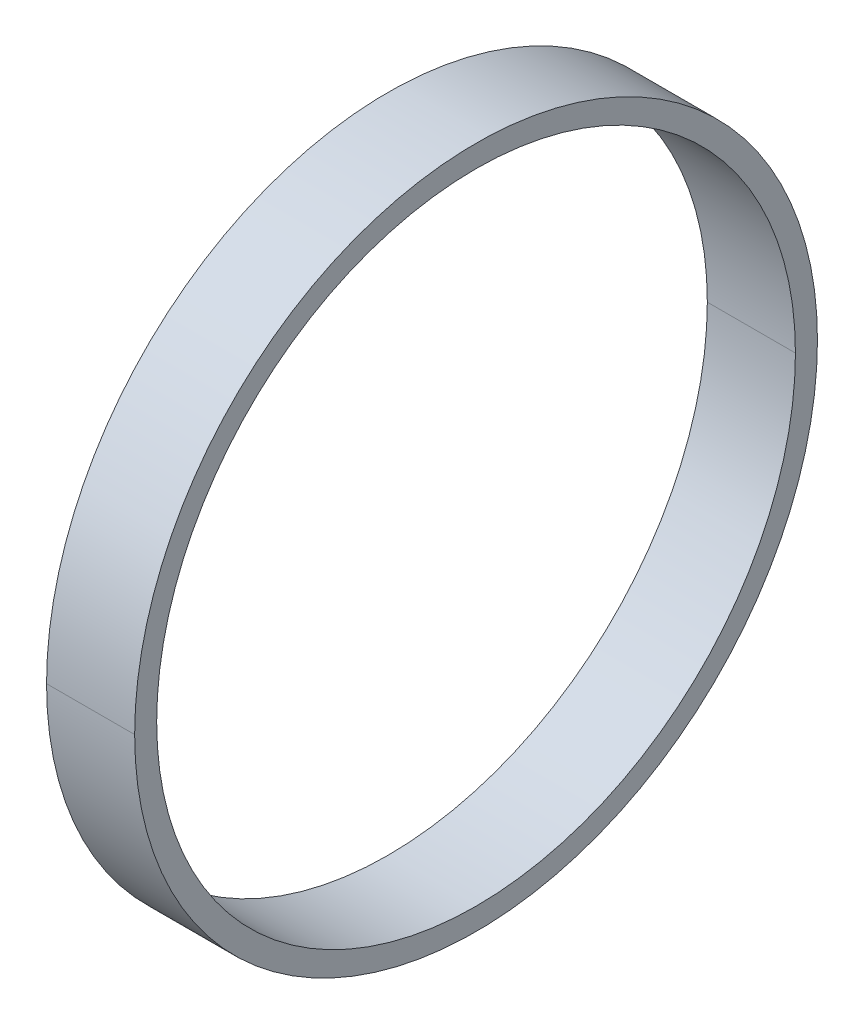
ISO-10303-21;
HEADER;
FILE_DESCRIPTION(('STEP AP214'),'2;1');
FILE_NAME('part.step','',(''),(''),'','','');
FILE_SCHEMA(('AUTOMOTIVE_DESIGN { 1 0 10303 214 1 1 1 1 }'));
ENDSEC;
DATA;
#1=APPLICATION_CONTEXT('core data for automotive mechanical design processes');
#2=APPLICATION_PROTOCOL_DEFINITION('international standard','automotive_design',2000,#1);
#3=PRODUCT_CONTEXT('',#1,'mechanical');
#4=PRODUCT('Part','Part','',(#3));
#5=PRODUCT_RELATED_PRODUCT_CATEGORY('part','',(#4));
#6=PRODUCT_DEFINITION_FORMATION('','',#4);
#7=PRODUCT_DEFINITION_CONTEXT('part definition',#1,'design');
#8=PRODUCT_DEFINITION('design','',#6,#7);
#9=PRODUCT_DEFINITION_SHAPE('','',#8);
#10=(LENGTH_UNIT() NAMED_UNIT(*) SI_UNIT(.MILLI.,.METRE.));
#11=(NAMED_UNIT(*) PLANE_ANGLE_UNIT() SI_UNIT($,.RADIAN.));
#12=(NAMED_UNIT(*) SI_UNIT($,.STERADIAN.) SOLID_ANGLE_UNIT());
#13=UNCERTAINTY_MEASURE_WITH_UNIT(LENGTH_MEASURE(1.E-05),#10,'distance_accuracy_value','');
#14=(GEOMETRIC_REPRESENTATION_CONTEXT(3) GLOBAL_UNCERTAINTY_ASSIGNED_CONTEXT((#13)) GLOBAL_UNIT_ASSIGNED_CONTEXT((#10,
#11,#12)) REPRESENTATION_CONTEXT('',''));
#15=CARTESIAN_POINT('',(0.,0.,0.));
#16=DIRECTION('',(0.,0.,1.));
#17=DIRECTION('',(1.,0.,0.));
#18=AXIS2_PLACEMENT_3D('',#15,#16,#17);
#19=CARTESIAN_POINT('',(0.,0.,0.));
#20=DIRECTION('',(-1.,0.,0.));
#21=DIRECTION('',(0.,0.,1.));
#22=AXIS2_PLACEMENT_3D('',#19,#20,#21);
#23=CYLINDRICAL_SURFACE('',#22,29.);
#24=DIRECTION('',(-1.,0.,0.));
#25=VECTOR('',#24,1.);
#26=CARTESIAN_POINT('',(0.,0.,-29.));
#27=LINE('',#26,#25);
#28=CARTESIAN_POINT('',(4.,0.,-29.));
#29=VERTEX_POINT('',#28);
#30=CARTESIAN_POINT('',(-4.,0.,-29.));
#31=VERTEX_POINT('',#30);
#32=EDGE_CURVE('E20',#29,#31,#27,.T.);
#33=ORIENTED_EDGE('',*,*,#32,.F.);
#34=CARTESIAN_POINT('',(4.,0.,0.));
#35=DIRECTION('',(-1.,0.,0.));
#36=DIRECTION('',(0.,0.,1.));
#37=AXIS2_PLACEMENT_3D('',#34,#35,#36);
#38=CIRCLE('',#37,29.);
#39=CARTESIAN_POINT('',(4.,0.,29.));
#40=VERTEX_POINT('',#39);
#41=EDGE_CURVE('E11',#40,#29,#38,.T.);
#42=ORIENTED_EDGE('',*,*,#41,.F.);
#43=DIRECTION('',(-1.,0.,0.));
#44=VECTOR('',#43,1.);
#45=CARTESIAN_POINT('',(0.,0.,29.));
#46=LINE('',#45,#44);
#47=CARTESIAN_POINT('',(-4.,0.,29.));
#48=VERTEX_POINT('',#47);
#49=EDGE_CURVE('E75',#40,#48,#46,.T.);
#50=ORIENTED_EDGE('',*,*,#49,.T.);
#51=CARTESIAN_POINT('',(-4.,0.,0.));
#52=DIRECTION('',(-1.,0.,0.));
#53=DIRECTION('',(0.,0.,1.));
#54=AXIS2_PLACEMENT_3D('',#51,#52,#53);
#55=CIRCLE('',#54,29.);
#56=EDGE_CURVE('E65',#48,#31,#55,.T.);
#57=ORIENTED_EDGE('',*,*,#56,.T.);
#58=EDGE_LOOP('',(#33,#42,#50,#57));
#59=FACE_BOUND('',#58,.T.);
#60=ADVANCED_FACE('F16',(#59),#23,.F.);
#61=CARTESIAN_POINT('',(4.,29.,0.));
#62=DIRECTION('',(-1.,0.,0.));
#63=DIRECTION('',(0.,0.,1.));
#64=AXIS2_PLACEMENT_3D('',#61,#62,#63);
#65=PLANE('',#64);
#66=ORIENTED_EDGE('',*,*,#41,.T.);
#67=CARTESIAN_POINT('',(4.,0.,0.));
#68=DIRECTION('',(-1.,0.,0.));
#69=DIRECTION('',(0.,0.,1.));
#70=AXIS2_PLACEMENT_3D('',#67,#68,#69);
#71=CIRCLE('',#70,29.);
#72=EDGE_CURVE('E85',#29,#40,#71,.T.);
#73=ORIENTED_EDGE('',*,*,#72,.T.);
#74=EDGE_LOOP('',(#66,#73));
#75=FACE_BOUND('',#74,.T.);
#76=CARTESIAN_POINT('',(4.,0.,0.));
#77=DIRECTION('',(-1.,0.,0.));
#78=DIRECTION('',(0.,0.,1.));
#79=AXIS2_PLACEMENT_3D('',#76,#77,#78);
#80=CIRCLE('',#79,31.);
#81=CARTESIAN_POINT('',(4.,0.,31.));
#82=VERTEX_POINT('',#81);
#83=CARTESIAN_POINT('',(4.,0.,-31.));
#84=VERTEX_POINT('',#83);
#85=EDGE_CURVE('E109',#82,#84,#80,.T.);
#86=ORIENTED_EDGE('',*,*,#85,.F.);
#87=CARTESIAN_POINT('',(4.,0.,0.));
#88=DIRECTION('',(-1.,0.,0.));
#89=DIRECTION('',(0.,0.,1.));
#90=AXIS2_PLACEMENT_3D('',#87,#88,#89);
#91=CIRCLE('',#90,31.);
#92=EDGE_CURVE('E27',#84,#82,#91,.T.);
#93=ORIENTED_EDGE('',*,*,#92,.F.);
#94=EDGE_LOOP('',(#86,#93));
#95=FACE_BOUND('',#94,.T.);
#96=ADVANCED_FACE('F163',(#75,#95),#65,.F.);
#97=CARTESIAN_POINT('',(0.,0.,0.));
#98=DIRECTION('',(-1.,0.,0.));
#99=DIRECTION('',(0.,0.,1.));
#100=AXIS2_PLACEMENT_3D('',#97,#98,#99);
#101=CYLINDRICAL_SURFACE('',#100,31.);
#102=DIRECTION('',(-1.,0.,0.));
#103=VECTOR('',#102,1.);
#104=CARTESIAN_POINT('',(0.,0.,-31.));
#105=LINE('',#104,#103);
#106=CARTESIAN_POINT('',(-4.,0.,-31.));
#107=VERTEX_POINT('',#106);
#108=EDGE_CURVE('E98',#84,#107,#105,.T.);
#109=ORIENTED_EDGE('',*,*,#108,.F.);
#110=ORIENTED_EDGE('',*,*,#92,.T.);
#111=DIRECTION('',(-1.,0.,0.));
#112=VECTOR('',#111,1.);
#113=CARTESIAN_POINT('',(0.,0.,31.));
#114=LINE('',#113,#112);
#115=CARTESIAN_POINT('',(-4.,0.,31.));
#116=VERTEX_POINT('',#115);
#117=EDGE_CURVE('E103',#82,#116,#114,.T.);
#118=ORIENTED_EDGE('',*,*,#117,.T.);
#119=CARTESIAN_POINT('',(-4.,0.,0.));
#120=DIRECTION('',(-1.,0.,0.));
#121=DIRECTION('',(0.,0.,1.));
#122=AXIS2_PLACEMENT_3D('',#119,#120,#121);
#123=CIRCLE('',#122,31.);
#124=EDGE_CURVE('E41',#107,#116,#123,.T.);
#125=ORIENTED_EDGE('',*,*,#124,.F.);
#126=EDGE_LOOP('',(#109,#110,#118,#125));
#127=FACE_BOUND('',#126,.T.);
#128=ADVANCED_FACE('F157',(#127),#101,.T.);
#129=CARTESIAN_POINT('',(-4.,29.,0.));
#130=DIRECTION('',(1.,0.,0.));
#131=DIRECTION('',(0.,1.,0.));
#132=AXIS2_PLACEMENT_3D('',#129,#130,#131);
#133=PLANE('',#132);
#134=ORIENTED_EDGE('',*,*,#56,.F.);
#135=CARTESIAN_POINT('',(-4.,0.,0.));
#136=DIRECTION('',(-1.,0.,0.));
#137=DIRECTION('',(0.,0.,1.));
#138=AXIS2_PLACEMENT_3D('',#135,#136,#137);
#139=CIRCLE('',#138,29.);
#140=EDGE_CURVE('E79',#31,#48,#139,.T.);
#141=ORIENTED_EDGE('',*,*,#140,.F.);
#142=EDGE_LOOP('',(#134,#141));
#143=FACE_BOUND('',#142,.T.);
#144=CARTESIAN_POINT('',(-4.,0.,0.));
#145=DIRECTION('',(-1.,0.,0.));
#146=DIRECTION('',(0.,0.,1.));
#147=AXIS2_PLACEMENT_3D('',#144,#145,#146);
#148=CIRCLE('',#147,31.);
#149=EDGE_CURVE('E106',#116,#107,#148,.T.);
#150=ORIENTED_EDGE('',*,*,#149,.T.);
#151=ORIENTED_EDGE('',*,*,#124,.T.);
#152=EDGE_LOOP('',(#150,#151));
#153=FACE_BOUND('',#152,.T.);
#154=ADVANCED_FACE('F18',(#143,#153),#133,.F.);
#155=CARTESIAN_POINT('',(0.,0.,0.));
#156=DIRECTION('',(-1.,0.,0.));
#157=DIRECTION('',(0.,0.,1.));
#158=AXIS2_PLACEMENT_3D('',#155,#156,#157);
#159=CYLINDRICAL_SURFACE('',#158,31.);
#160=ORIENTED_EDGE('',*,*,#85,.T.);
#161=ORIENTED_EDGE('',*,*,#108,.T.);
#162=ORIENTED_EDGE('',*,*,#149,.F.);
#163=ORIENTED_EDGE('',*,*,#117,.F.);
#164=EDGE_LOOP('',(#160,#161,#162,#163));
#165=FACE_BOUND('',#164,.T.);
#166=ADVANCED_FACE('F154',(#165),#159,.T.);
#167=CARTESIAN_POINT('',(0.,0.,0.));
#168=DIRECTION('',(-1.,0.,0.));
#169=DIRECTION('',(0.,0.,1.));
#170=AXIS2_PLACEMENT_3D('',#167,#168,#169);
#171=CYLINDRICAL_SURFACE('',#170,29.);
#172=ORIENTED_EDGE('',*,*,#72,.F.);
#173=ORIENTED_EDGE('',*,*,#32,.T.);
#174=ORIENTED_EDGE('',*,*,#140,.T.);
#175=ORIENTED_EDGE('',*,*,#49,.F.);
#176=EDGE_LOOP('',(#172,#173,#174,#175));
#177=FACE_BOUND('',#176,.T.);
#178=ADVANCED_FACE('F83',(#177),#171,.F.);
#179=CLOSED_SHELL('',(#60,#96,#128,#154,#166,#178));
#180=MANIFOLD_SOLID_BREP('B1',#179);
#181=ADVANCED_BREP_SHAPE_REPRESENTATION('',(#18,#180),#14);
#182=SHAPE_DEFINITION_REPRESENTATION(#9,#181);
ENDSEC;
END-ISO-10303-21;
